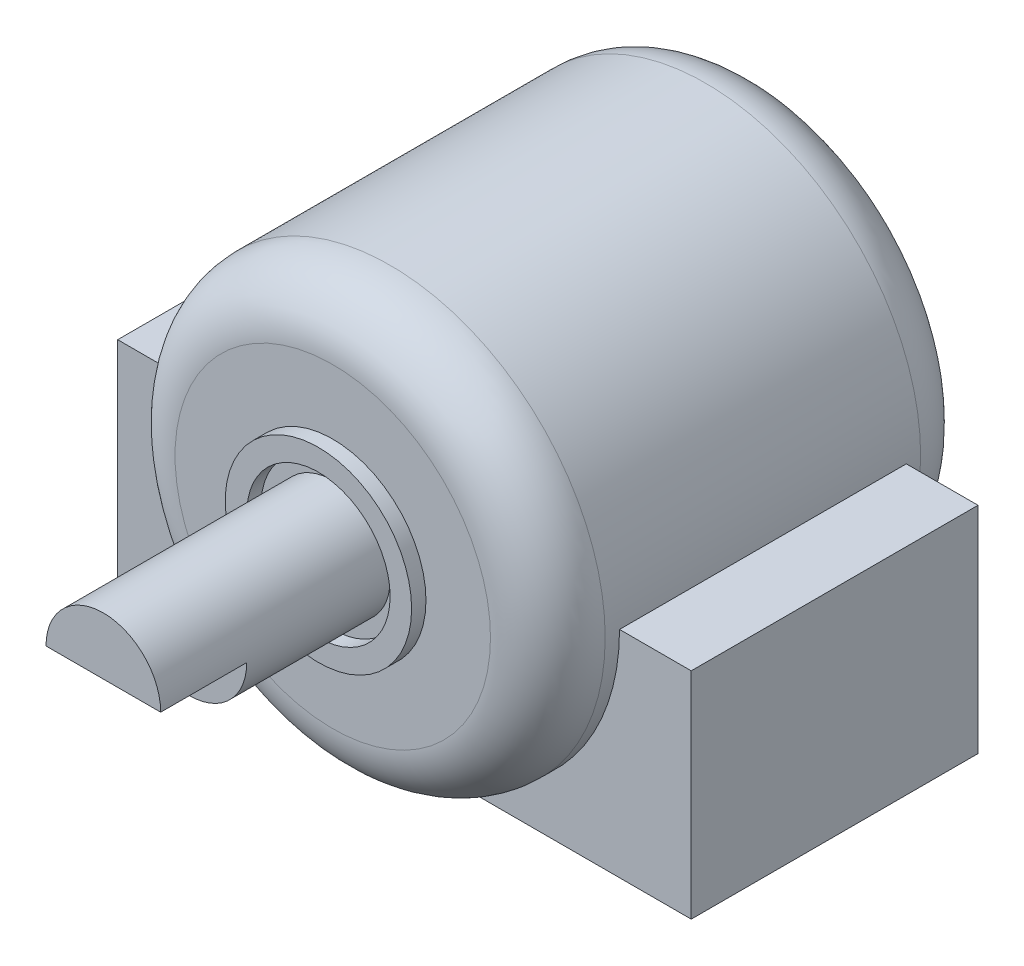
ISO-10303-21;
HEADER;
FILE_DESCRIPTION(('STEP AP214'),'2;1');
FILE_NAME('part.step','',(''),(''),'','','');
FILE_SCHEMA(('AUTOMOTIVE_DESIGN { 1 0 10303 214 1 1 1 1 }'));
ENDSEC;
DATA;
#1=APPLICATION_CONTEXT('core data for automotive mechanical design processes');
#2=APPLICATION_PROTOCOL_DEFINITION('international standard','automotive_design',2000,#1);
#3=PRODUCT_CONTEXT('',#1,'mechanical');
#4=PRODUCT('Part','Part','',(#3));
#5=PRODUCT_RELATED_PRODUCT_CATEGORY('part','',(#4));
#6=PRODUCT_DEFINITION_FORMATION('','',#4);
#7=PRODUCT_DEFINITION_CONTEXT('part definition',#1,'design');
#8=PRODUCT_DEFINITION('design','',#6,#7);
#9=PRODUCT_DEFINITION_SHAPE('','',#8);
#10=(LENGTH_UNIT() NAMED_UNIT(*) SI_UNIT(.MILLI.,.METRE.));
#11=(NAMED_UNIT(*) PLANE_ANGLE_UNIT() SI_UNIT($,.RADIAN.));
#12=(NAMED_UNIT(*) SI_UNIT($,.STERADIAN.) SOLID_ANGLE_UNIT());
#13=UNCERTAINTY_MEASURE_WITH_UNIT(LENGTH_MEASURE(1.E-05),#10,'distance_accuracy_value','');
#14=(GEOMETRIC_REPRESENTATION_CONTEXT(3) GLOBAL_UNCERTAINTY_ASSIGNED_CONTEXT((#13)) GLOBAL_UNIT_ASSIGNED_CONTEXT((#10,
#11,#12)) REPRESENTATION_CONTEXT('',''));
#15=CARTESIAN_POINT('',(0.,0.,0.));
#16=DIRECTION('',(0.,0.,1.));
#17=DIRECTION('',(1.,0.,0.));
#18=AXIS2_PLACEMENT_3D('',#15,#16,#17);
#19=CARTESIAN_POINT('',(0.,0.,7.5));
#20=DIRECTION('',(0.,0.,-1.));
#21=DIRECTION('',(-1.,0.,0.));
#22=AXIS2_PLACEMENT_3D('',#19,#20,#21);
#23=CYLINDRICAL_SURFACE('',#22,7.5);
#24=CARTESIAN_POINT('',(0.,0.,5.5));
#25=DIRECTION('',(0.,0.,1.));
#26=DIRECTION('',(1.,0.,0.));
#27=AXIS2_PLACEMENT_3D('',#24,#25,#26);
#28=CIRCLE('',#27,7.5);
#29=CARTESIAN_POINT('',(7.5,0.,5.5));
#30=VERTEX_POINT('',#29);
#31=EDGE_CURVE('E52',#30,#30,#28,.F.);
#32=ORIENTED_EDGE('',*,*,#31,.T.);
#33=EDGE_LOOP('',(#32));
#34=FACE_BOUND('',#33,.T.);
#35=CARTESIAN_POINT('',(0.,0.,-5.5));
#36=DIRECTION('',(0.,0.,1.));
#37=DIRECTION('',(1.,0.,0.));
#38=AXIS2_PLACEMENT_3D('',#35,#36,#37);
#39=CIRCLE('',#38,7.5);
#40=CARTESIAN_POINT('',(7.5,0.,-5.5));
#41=VERTEX_POINT('',#40);
#42=EDGE_CURVE('E240',#41,#41,#39,.T.);
#43=ORIENTED_EDGE('',*,*,#42,.T.);
#44=EDGE_LOOP('',(#43));
#45=FACE_BOUND('',#44,.T.);
#46=CARTESIAN_POINT('',(0.,0.,5.));
#47=DIRECTION('',(0.,0.,1.));
#48=DIRECTION('',(1.,0.,0.));
#49=AXIS2_PLACEMENT_3D('',#46,#47,#48);
#50=CIRCLE('',#49,7.5);
#51=CARTESIAN_POINT('',(-7.5,0.,5.));
#52=VERTEX_POINT('',#51);
#53=CARTESIAN_POINT('',(0.,-7.5,5.));
#54=VERTEX_POINT('',#53);
#55=EDGE_CURVE('E227',#52,#54,#50,.T.);
#56=ORIENTED_EDGE('',*,*,#55,.T.);
#57=CARTESIAN_POINT('',(7.5,0.,5.));
#58=VERTEX_POINT('',#57);
#59=EDGE_CURVE('E232',#54,#58,#50,.T.);
#60=ORIENTED_EDGE('',*,*,#59,.T.);
#61=DIRECTION('',(0.,0.,-1.));
#62=VECTOR('',#61,1.);
#63=CARTESIAN_POINT('',(7.5,0.,7.5));
#64=LINE('',#63,#62);
#65=CARTESIAN_POINT('',(7.5,0.,-5.));
#66=VERTEX_POINT('',#65);
#67=EDGE_CURVE('E231',#58,#66,#64,.T.);
#68=ORIENTED_EDGE('',*,*,#67,.T.);
#69=CARTESIAN_POINT('',(0.,0.,-5.));
#70=DIRECTION('',(0.,0.,-1.));
#71=DIRECTION('',(-1.,0.,0.));
#72=AXIS2_PLACEMENT_3D('',#69,#70,#71);
#73=CIRCLE('',#72,7.5);
#74=CARTESIAN_POINT('',(0.,-7.5,-5.));
#75=VERTEX_POINT('',#74);
#76=EDGE_CURVE('E226',#66,#75,#73,.T.);
#77=ORIENTED_EDGE('',*,*,#76,.T.);
#78=CARTESIAN_POINT('',(-7.5,0.,-5.));
#79=VERTEX_POINT('',#78);
#80=EDGE_CURVE('E222',#75,#79,#73,.T.);
#81=ORIENTED_EDGE('',*,*,#80,.T.);
#82=DIRECTION('',(0.,0.,-1.));
#83=VECTOR('',#82,1.);
#84=CARTESIAN_POINT('',(-7.5,0.,7.5));
#85=LINE('',#84,#83);
#86=EDGE_CURVE('E218',#79,#52,#85,.F.);
#87=ORIENTED_EDGE('',*,*,#86,.T.);
#88=EDGE_LOOP('',(#56,#60,#68,#77,#81,#87));
#89=FACE_BOUND('',#88,.T.);
#90=ADVANCED_FACE('F43',(#34,#45,#89),#23,.T.);
#91=CARTESIAN_POINT('',(0.,0.,7.5));
#92=DIRECTION('',(0.,0.,1.));
#93=DIRECTION('',(1.,0.,0.));
#94=AXIS2_PLACEMENT_3D('',#91,#92,#93);
#95=PLANE('',#94);
#96=CARTESIAN_POINT('',(0.,0.,7.5));
#97=DIRECTION('',(0.,0.,1.));
#98=DIRECTION('',(1.,0.,0.));
#99=AXIS2_PLACEMENT_3D('',#96,#97,#98);
#100=CIRCLE('',#99,5.5);
#101=CARTESIAN_POINT('',(5.5,0.,7.5));
#102=VERTEX_POINT('',#101);
#103=EDGE_CURVE('E236',#102,#102,#100,.T.);
#104=ORIENTED_EDGE('',*,*,#103,.T.);
#105=EDGE_LOOP('',(#104));
#106=FACE_BOUND('',#105,.T.);
#107=CARTESIAN_POINT('',(0.,0.,7.5));
#108=DIRECTION('',(0.,0.,1.));
#109=DIRECTION('',(1.,0.,0.));
#110=AXIS2_PLACEMENT_3D('',#107,#108,#109);
#111=CIRCLE('',#110,3.25);
#112=CARTESIAN_POINT('',(3.25,0.,7.5));
#113=VERTEX_POINT('',#112);
#114=EDGE_CURVE('E206',#113,#113,#111,.T.);
#115=ORIENTED_EDGE('',*,*,#114,.F.);
#116=EDGE_LOOP('',(#115));
#117=FACE_BOUND('',#116,.T.);
#118=ADVANCED_FACE('F255',(#106,#117),#95,.T.);
#119=CARTESIAN_POINT('',(0.,0.,-7.5));
#120=DIRECTION('',(0.,0.,1.));
#121=DIRECTION('',(1.,0.,0.));
#122=AXIS2_PLACEMENT_3D('',#119,#120,#121);
#123=PLANE('',#122);
#124=CARTESIAN_POINT('',(0.,0.,-7.5));
#125=DIRECTION('',(0.,0.,1.));
#126=DIRECTION('',(1.,0.,0.));
#127=AXIS2_PLACEMENT_3D('',#124,#125,#126);
#128=CIRCLE('',#127,5.5);
#129=CARTESIAN_POINT('',(5.5,0.,-7.5));
#130=VERTEX_POINT('',#129);
#131=EDGE_CURVE('E11',#130,#130,#128,.F.);
#132=ORIENTED_EDGE('',*,*,#131,.T.);
#133=EDGE_LOOP('',(#132));
#134=FACE_BOUND('',#133,.T.);
#135=ADVANCED_FACE('F258',(#134),#123,.F.);
#136=CARTESIAN_POINT('',(0.,0.,8.));
#137=DIRECTION('',(0.,0.,1.));
#138=DIRECTION('',(1.,0.,0.));
#139=AXIS2_PLACEMENT_3D('',#136,#137,#138);
#140=PLANE('',#139);
#141=CARTESIAN_POINT('',(0.,0.,8.));
#142=DIRECTION('',(0.,0.,1.));
#143=DIRECTION('',(1.,0.,0.));
#144=AXIS2_PLACEMENT_3D('',#141,#142,#143);
#145=CIRCLE('',#144,3.25);
#146=CARTESIAN_POINT('',(3.25,0.,8.));
#147=VERTEX_POINT('',#146);
#148=EDGE_CURVE('E207',#147,#147,#145,.T.);
#149=ORIENTED_EDGE('',*,*,#148,.T.);
#150=EDGE_LOOP('',(#149));
#151=FACE_BOUND('',#150,.T.);
#152=CARTESIAN_POINT('',(0.,0.,8.));
#153=DIRECTION('',(0.,0.,1.));
#154=DIRECTION('',(1.,0.,0.));
#155=AXIS2_PLACEMENT_3D('',#152,#153,#154);
#156=CIRCLE('',#155,2.5);
#157=CARTESIAN_POINT('',(2.5,0.,8.));
#158=VERTEX_POINT('',#157);
#159=EDGE_CURVE('E199',#158,#158,#156,.T.);
#160=ORIENTED_EDGE('',*,*,#159,.F.);
#161=EDGE_LOOP('',(#160));
#162=FACE_BOUND('',#161,.T.);
#163=ADVANCED_FACE('F266',(#151,#162),#140,.T.);
#164=CARTESIAN_POINT('',(0.,0.,8.));
#165=DIRECTION('',(0.,0.,-1.));
#166=DIRECTION('',(-1.,0.,0.));
#167=AXIS2_PLACEMENT_3D('',#164,#165,#166);
#168=CYLINDRICAL_SURFACE('',#167,3.25);
#169=ORIENTED_EDGE('',*,*,#148,.F.);
#170=EDGE_LOOP('',(#169));
#171=FACE_BOUND('',#170,.T.);
#172=ORIENTED_EDGE('',*,*,#114,.T.);
#173=EDGE_LOOP('',(#172));
#174=FACE_BOUND('',#173,.T.);
#175=ADVANCED_FACE('F263',(#171,#174),#168,.T.);
#176=CARTESIAN_POINT('',(0.,0.,8.));
#177=DIRECTION('',(0.,0.,-1.));
#178=DIRECTION('',(-1.,0.,0.));
#179=AXIS2_PLACEMENT_3D('',#176,#177,#178);
#180=CYLINDRICAL_SURFACE('',#179,2.5);
#181=ORIENTED_EDGE('',*,*,#159,.T.);
#182=EDGE_LOOP('',(#181));
#183=FACE_BOUND('',#182,.T.);
#184=CARTESIAN_POINT('',(0.,0.,7.5));
#185=DIRECTION('',(0.,0.,1.));
#186=DIRECTION('',(1.,0.,0.));
#187=AXIS2_PLACEMENT_3D('',#184,#185,#186);
#188=CIRCLE('',#187,2.5);
#189=CARTESIAN_POINT('',(2.5,0.,7.5));
#190=VERTEX_POINT('',#189);
#191=EDGE_CURVE('E211',#190,#190,#188,.F.);
#192=ORIENTED_EDGE('',*,*,#191,.T.);
#193=EDGE_LOOP('',(#192));
#194=FACE_BOUND('',#193,.T.);
#195=ADVANCED_FACE('F265',(#183,#194),#180,.F.);
#196=CARTESIAN_POINT('',(0.,0.,7.5));
#197=DIRECTION('',(0.,0.,1.));
#198=DIRECTION('',(1.,0.,0.));
#199=AXIS2_PLACEMENT_3D('',#196,#197,#198);
#200=CIRCLE('',#199,2.);
#201=CARTESIAN_POINT('',(2.,0.,7.5));
#202=VERTEX_POINT('',#201);
#203=EDGE_CURVE('E192',#202,#202,#200,.T.);
#204=ORIENTED_EDGE('',*,*,#203,.F.);
#205=EDGE_LOOP('',(#204));
#206=FACE_BOUND('',#205,.T.);
#207=ORIENTED_EDGE('',*,*,#191,.F.);
#208=EDGE_LOOP('',(#207));
#209=FACE_BOUND('',#208,.T.);
#210=ADVANCED_FACE('F260',(#206,#209),#95,.T.);
#211=CARTESIAN_POINT('',(0.,0.,15.5));
#212=DIRECTION('',(0.,0.,-1.));
#213=DIRECTION('',(-1.,0.,0.));
#214=AXIS2_PLACEMENT_3D('',#211,#212,#213);
#215=CYLINDRICAL_SURFACE('',#214,2.);
#216=CARTESIAN_POINT('',(0.,0.,15.5));
#217=DIRECTION('',(0.,0.,1.));
#218=DIRECTION('',(1.,0.,0.));
#219=AXIS2_PLACEMENT_3D('',#216,#217,#218);
#220=CIRCLE('',#219,2.);
#221=CARTESIAN_POINT('',(2.,0.,15.5));
#222=VERTEX_POINT('',#221);
#223=CARTESIAN_POINT('',(-2.,0.,15.5));
#224=VERTEX_POINT('',#223);
#225=EDGE_CURVE('E195',#222,#224,#220,.T.);
#226=ORIENTED_EDGE('',*,*,#225,.F.);
#227=DIRECTION('',(0.,0.,1.));
#228=VECTOR('',#227,1.);
#229=CARTESIAN_POINT('',(2.,0.,12.5));
#230=LINE('',#229,#228);
#231=CARTESIAN_POINT('',(2.,0.,12.5));
#232=VERTEX_POINT('',#231);
#233=EDGE_CURVE('E67',#232,#222,#230,.T.);
#234=ORIENTED_EDGE('',*,*,#233,.F.);
#235=CARTESIAN_POINT('',(0.,0.,12.5));
#236=DIRECTION('',(0.,0.,1.));
#237=DIRECTION('',(1.,0.,0.));
#238=AXIS2_PLACEMENT_3D('',#235,#236,#237);
#239=CIRCLE('',#238,2.);
#240=CARTESIAN_POINT('',(-2.,0.,12.5));
#241=VERTEX_POINT('',#240);
#242=EDGE_CURVE('E179',#241,#232,#239,.T.);
#243=ORIENTED_EDGE('',*,*,#242,.F.);
#244=DIRECTION('',(0.,0.,1.));
#245=VECTOR('',#244,1.);
#246=CARTESIAN_POINT('',(-2.,0.,12.5));
#247=LINE('',#246,#245);
#248=EDGE_CURVE('E188',#241,#224,#247,.T.);
#249=ORIENTED_EDGE('',*,*,#248,.T.);
#250=EDGE_LOOP('',(#226,#234,#243,#249));
#251=FACE_BOUND('',#250,.T.);
#252=ORIENTED_EDGE('',*,*,#203,.T.);
#253=EDGE_LOOP('',(#252));
#254=FACE_BOUND('',#253,.T.);
#255=ADVANCED_FACE('F336',(#251,#254),#215,.T.);
#256=CARTESIAN_POINT('',(0.,0.,15.5));
#257=DIRECTION('',(0.,0.,1.));
#258=DIRECTION('',(1.,0.,0.));
#259=AXIS2_PLACEMENT_3D('',#256,#257,#258);
#260=PLANE('',#259);
#261=DIRECTION('',(-1.,0.,0.));
#262=VECTOR('',#261,1.);
#263=CARTESIAN_POINT('',(-2.,0.,15.5));
#264=LINE('',#263,#262);
#265=EDGE_CURVE('E172',#222,#224,#264,.T.);
#266=ORIENTED_EDGE('',*,*,#265,.F.);
#267=ORIENTED_EDGE('',*,*,#225,.T.);
#268=EDGE_LOOP('',(#266,#267));
#269=FACE_BOUND('',#268,.T.);
#270=ADVANCED_FACE('F331',(#269),#260,.T.);
#271=CARTESIAN_POINT('',(-2.,0.,12.5));
#272=DIRECTION('',(0.,1.,0.));
#273=DIRECTION('',(0.,0.,1.));
#274=AXIS2_PLACEMENT_3D('',#271,#272,#273);
#275=PLANE('',#274);
#276=ORIENTED_EDGE('',*,*,#265,.T.);
#277=ORIENTED_EDGE('',*,*,#248,.F.);
#278=DIRECTION('',(-1.,0.,0.));
#279=VECTOR('',#278,1.);
#280=CARTESIAN_POINT('',(-2.,0.,12.5));
#281=LINE('',#280,#279);
#282=EDGE_CURVE('E182',#232,#241,#281,.T.);
#283=ORIENTED_EDGE('',*,*,#282,.F.);
#284=ORIENTED_EDGE('',*,*,#233,.T.);
#285=EDGE_LOOP('',(#276,#277,#283,#284));
#286=FACE_BOUND('',#285,.T.);
#287=ADVANCED_FACE('F325',(#286),#275,.F.);
#288=CARTESIAN_POINT('',(0.,0.,12.5));
#289=DIRECTION('',(0.,0.,1.));
#290=DIRECTION('',(1.,0.,0.));
#291=AXIS2_PLACEMENT_3D('',#288,#289,#290);
#292=PLANE('',#291);
#293=ORIENTED_EDGE('',*,*,#242,.T.);
#294=ORIENTED_EDGE('',*,*,#282,.T.);
#295=EDGE_LOOP('',(#293,#294));
#296=FACE_BOUND('',#295,.T.);
#297=ADVANCED_FACE('F319',(#296),#292,.T.);
#298=CARTESIAN_POINT('',(-10.,-7.5,5.));
#299=DIRECTION('',(0.,0.,1.));
#300=DIRECTION('',(1.,0.,0.));
#301=AXIS2_PLACEMENT_3D('',#298,#299,#300);
#302=PLANE('',#301);
#303=ORIENTED_EDGE('',*,*,#55,.F.);
#304=DIRECTION('',(1.,0.,0.));
#305=VECTOR('',#304,1.);
#306=CARTESIAN_POINT('',(-10.,0.,5.));
#307=LINE('',#306,#305);
#308=CARTESIAN_POINT('',(-10.,0.,5.));
#309=VERTEX_POINT('',#308);
#310=EDGE_CURVE('E59',#309,#52,#307,.T.);
#311=ORIENTED_EDGE('',*,*,#310,.F.);
#312=DIRECTION('',(0.,1.,0.));
#313=VECTOR('',#312,1.);
#314=CARTESIAN_POINT('',(-10.,-7.5,5.));
#315=LINE('',#314,#313);
#316=CARTESIAN_POINT('',(-10.,-7.5,5.));
#317=VERTEX_POINT('',#316);
#318=EDGE_CURVE('E173',#317,#309,#315,.T.);
#319=ORIENTED_EDGE('',*,*,#318,.F.);
#320=DIRECTION('',(1.,0.,0.));
#321=VECTOR('',#320,1.);
#322=CARTESIAN_POINT('',(-10.,-7.5,5.));
#323=LINE('',#322,#321);
#324=EDGE_CURVE('E130',#317,#54,#323,.T.);
#325=ORIENTED_EDGE('',*,*,#324,.T.);
#326=EDGE_LOOP('',(#303,#311,#319,#325));
#327=FACE_BOUND('',#326,.T.);
#328=ADVANCED_FACE('F295',(#327),#302,.T.);
#329=CARTESIAN_POINT('',(-10.,-7.5,-5.));
#330=DIRECTION('',(0.,0.,-1.));
#331=DIRECTION('',(-1.,0.,0.));
#332=AXIS2_PLACEMENT_3D('',#329,#330,#331);
#333=PLANE('',#332);
#334=ORIENTED_EDGE('',*,*,#76,.F.);
#335=DIRECTION('',(-1.,0.,0.));
#336=VECTOR('',#335,1.);
#337=CARTESIAN_POINT('',(-10.,0.,-5.));
#338=LINE('',#337,#336);
#339=CARTESIAN_POINT('',(10.,0.,-5.));
#340=VERTEX_POINT('',#339);
#341=EDGE_CURVE('E123',#340,#66,#338,.T.);
#342=ORIENTED_EDGE('',*,*,#341,.F.);
#343=DIRECTION('',(0.,1.,0.));
#344=VECTOR('',#343,1.);
#345=CARTESIAN_POINT('',(10.,-7.5,-5.));
#346=LINE('',#345,#344);
#347=CARTESIAN_POINT('',(10.,-7.5,-5.));
#348=VERTEX_POINT('',#347);
#349=EDGE_CURVE('E117',#348,#340,#346,.T.);
#350=ORIENTED_EDGE('',*,*,#349,.F.);
#351=DIRECTION('',(-1.,0.,0.));
#352=VECTOR('',#351,1.);
#353=CARTESIAN_POINT('',(-10.,-7.5,-5.));
#354=LINE('',#353,#352);
#355=EDGE_CURVE('E120',#348,#75,#354,.T.);
#356=ORIENTED_EDGE('',*,*,#355,.T.);
#357=EDGE_LOOP('',(#334,#342,#350,#356));
#358=FACE_BOUND('',#357,.T.);
#359=ADVANCED_FACE('F119',(#358),#333,.T.);
#360=CARTESIAN_POINT('',(0.,-7.5,0.));
#361=DIRECTION('',(0.,1.,0.));
#362=DIRECTION('',(0.,0.,1.));
#363=AXIS2_PLACEMENT_3D('',#360,#361,#362);
#364=PLANE('',#363);
#365=CARTESIAN_POINT('',(10.,-7.5,5.));
#366=VERTEX_POINT('',#365);
#367=EDGE_CURVE('E157',#54,#366,#323,.T.);
#368=ORIENTED_EDGE('',*,*,#367,.F.);
#369=ORIENTED_EDGE('',*,*,#324,.F.);
#370=DIRECTION('',(0.,0.,1.));
#371=VECTOR('',#370,1.);
#372=CARTESIAN_POINT('',(-10.,-7.5,-5.));
#373=LINE('',#372,#371);
#374=CARTESIAN_POINT('',(-10.,-7.5,-5.));
#375=VERTEX_POINT('',#374);
#376=EDGE_CURVE('E141',#375,#317,#373,.T.);
#377=ORIENTED_EDGE('',*,*,#376,.F.);
#378=EDGE_CURVE('E139',#75,#375,#354,.T.);
#379=ORIENTED_EDGE('',*,*,#378,.F.);
#380=ORIENTED_EDGE('',*,*,#355,.F.);
#381=DIRECTION('',(0.,0.,-1.));
#382=VECTOR('',#381,1.);
#383=CARTESIAN_POINT('',(10.,-7.5,-5.));
#384=LINE('',#383,#382);
#385=EDGE_CURVE('E137',#366,#348,#384,.T.);
#386=ORIENTED_EDGE('',*,*,#385,.F.);
#387=EDGE_LOOP('',(#368,#369,#377,#379,#380,#386));
#388=FACE_BOUND('',#387,.T.);
#389=ADVANCED_FACE('F136',(#388),#364,.F.);
#390=CARTESIAN_POINT('',(0.,0.,0.));
#391=DIRECTION('',(0.,1.,0.));
#392=DIRECTION('',(0.,0.,1.));
#393=AXIS2_PLACEMENT_3D('',#390,#391,#392);
#394=PLANE('',#393);
#395=ORIENTED_EDGE('',*,*,#67,.F.);
#396=CARTESIAN_POINT('',(10.,0.,5.));
#397=VERTEX_POINT('',#396);
#398=EDGE_CURVE('E151',#58,#397,#307,.T.);
#399=ORIENTED_EDGE('',*,*,#398,.T.);
#400=DIRECTION('',(0.,0.,-1.));
#401=VECTOR('',#400,1.);
#402=CARTESIAN_POINT('',(10.,0.,-5.));
#403=LINE('',#402,#401);
#404=EDGE_CURVE('E161',#397,#340,#403,.T.);
#405=ORIENTED_EDGE('',*,*,#404,.T.);
#406=ORIENTED_EDGE('',*,*,#341,.T.);
#407=EDGE_LOOP('',(#395,#399,#405,#406));
#408=FACE_BOUND('',#407,.T.);
#409=ADVANCED_FACE('F302',(#408),#394,.T.);
#410=ORIENTED_EDGE('',*,*,#86,.F.);
#411=CARTESIAN_POINT('',(-10.,0.,-5.));
#412=VERTEX_POINT('',#411);
#413=EDGE_CURVE('E164',#79,#412,#338,.T.);
#414=ORIENTED_EDGE('',*,*,#413,.T.);
#415=DIRECTION('',(0.,0.,1.));
#416=VECTOR('',#415,1.);
#417=CARTESIAN_POINT('',(-10.,0.,-5.));
#418=LINE('',#417,#416);
#419=EDGE_CURVE('E167',#412,#309,#418,.T.);
#420=ORIENTED_EDGE('',*,*,#419,.T.);
#421=ORIENTED_EDGE('',*,*,#310,.T.);
#422=EDGE_LOOP('',(#410,#414,#420,#421));
#423=FACE_BOUND('',#422,.T.);
#424=ADVANCED_FACE('F315',(#423),#394,.T.);
#425=CARTESIAN_POINT('',(10.,-7.5,-5.));
#426=DIRECTION('',(1.,0.,0.));
#427=DIRECTION('',(0.,0.,-1.));
#428=AXIS2_PLACEMENT_3D('',#425,#426,#427);
#429=PLANE('',#428);
#430=ORIENTED_EDGE('',*,*,#404,.F.);
#431=DIRECTION('',(0.,1.,0.));
#432=VECTOR('',#431,1.);
#433=CARTESIAN_POINT('',(10.,-7.5,5.));
#434=LINE('',#433,#432);
#435=EDGE_CURVE('E146',#366,#397,#434,.T.);
#436=ORIENTED_EDGE('',*,*,#435,.F.);
#437=ORIENTED_EDGE('',*,*,#385,.T.);
#438=ORIENTED_EDGE('',*,*,#349,.T.);
#439=EDGE_LOOP('',(#430,#436,#437,#438));
#440=FACE_BOUND('',#439,.T.);
#441=ADVANCED_FACE('F144',(#440),#429,.T.);
#442=ORIENTED_EDGE('',*,*,#59,.F.);
#443=ORIENTED_EDGE('',*,*,#367,.T.);
#444=ORIENTED_EDGE('',*,*,#435,.T.);
#445=ORIENTED_EDGE('',*,*,#398,.F.);
#446=EDGE_LOOP('',(#442,#443,#444,#445));
#447=FACE_BOUND('',#446,.T.);
#448=ADVANCED_FACE('F305',(#447),#302,.T.);
#449=CARTESIAN_POINT('',(-10.,-7.5,-5.));
#450=DIRECTION('',(-1.,0.,0.));
#451=DIRECTION('',(0.,0.,1.));
#452=AXIS2_PLACEMENT_3D('',#449,#450,#451);
#453=PLANE('',#452);
#454=ORIENTED_EDGE('',*,*,#419,.F.);
#455=DIRECTION('',(0.,1.,0.));
#456=VECTOR('',#455,1.);
#457=CARTESIAN_POINT('',(-10.,-7.5,-5.));
#458=LINE('',#457,#456);
#459=EDGE_CURVE('E129',#375,#412,#458,.T.);
#460=ORIENTED_EDGE('',*,*,#459,.F.);
#461=ORIENTED_EDGE('',*,*,#376,.T.);
#462=ORIENTED_EDGE('',*,*,#318,.T.);
#463=EDGE_LOOP('',(#454,#460,#461,#462));
#464=FACE_BOUND('',#463,.T.);
#465=ADVANCED_FACE('F307',(#464),#453,.T.);
#466=ORIENTED_EDGE('',*,*,#80,.F.);
#467=ORIENTED_EDGE('',*,*,#378,.T.);
#468=ORIENTED_EDGE('',*,*,#459,.T.);
#469=ORIENTED_EDGE('',*,*,#413,.F.);
#470=EDGE_LOOP('',(#466,#467,#468,#469));
#471=FACE_BOUND('',#470,.T.);
#472=ADVANCED_FACE('F252',(#471),#333,.T.);
#473=CARTESIAN_POINT('',(0.,0.,5.5));
#474=DIRECTION('',(0.,0.,1.));
#475=DIRECTION('',(1.,0.,0.));
#476=AXIS2_PLACEMENT_3D('',#473,#474,#475);
#477=TOROIDAL_SURFACE('',#476,5.5,2.);
#478=ORIENTED_EDGE('',*,*,#31,.F.);
#479=EDGE_LOOP('',(#478));
#480=FACE_BOUND('',#479,.T.);
#481=ORIENTED_EDGE('',*,*,#103,.F.);
#482=EDGE_LOOP('',(#481));
#483=FACE_BOUND('',#482,.T.);
#484=ADVANCED_FACE('F249',(#480,#483),#477,.T.);
#485=CARTESIAN_POINT('',(0.,0.,-5.5));
#486=DIRECTION('',(0.,0.,1.));
#487=DIRECTION('',(1.,0.,0.));
#488=AXIS2_PLACEMENT_3D('',#485,#486,#487);
#489=TOROIDAL_SURFACE('',#488,5.5,2.);
#490=ORIENTED_EDGE('',*,*,#131,.F.);
#491=EDGE_LOOP('',(#490));
#492=FACE_BOUND('',#491,.T.);
#493=ORIENTED_EDGE('',*,*,#42,.F.);
#494=EDGE_LOOP('',(#493));
#495=FACE_BOUND('',#494,.T.);
#496=ADVANCED_FACE('F45',(#492,#495),#489,.T.);
#497=CLOSED_SHELL('',(#90,#118,#135,#163,#175,#195,#210,#255,#270,#287,#297,#328,#359,#389,#409,
#424,#441,#448,#465,#472,#484,#496));
#498=MANIFOLD_SOLID_BREP('B2',#497);
#499=ADVANCED_BREP_SHAPE_REPRESENTATION('',(#18,#498),#14);
#500=SHAPE_DEFINITION_REPRESENTATION(#9,#499);
ENDSEC;
END-ISO-10303-21;
